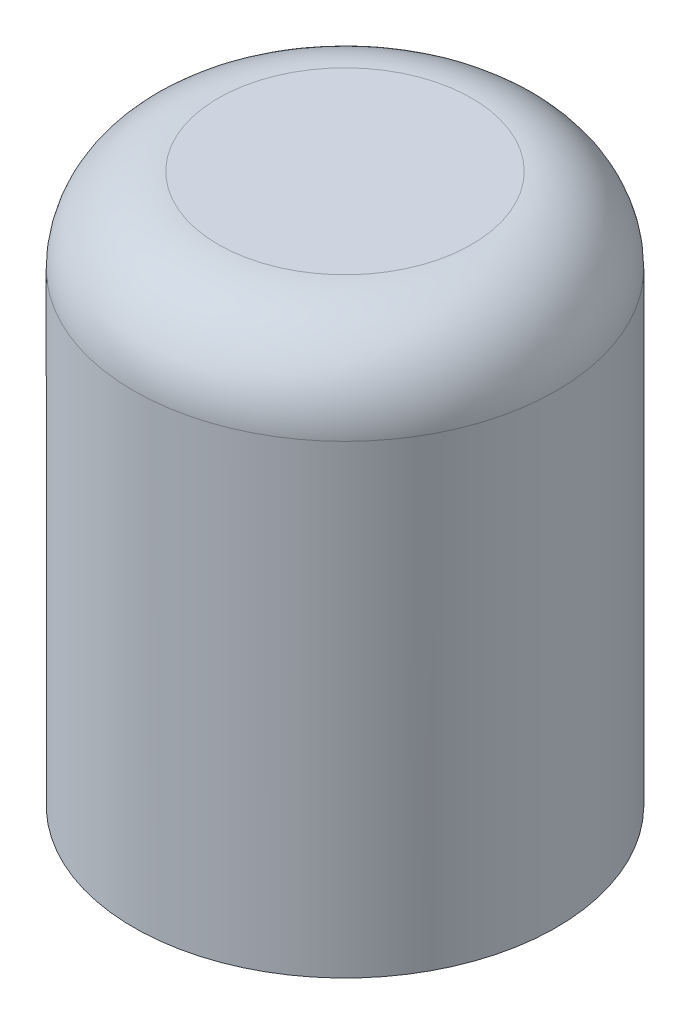
ISO-10303-21;
HEADER;
FILE_DESCRIPTION(('STEP AP214'),'2;1');
FILE_NAME('part.step','',(''),(''),'','','');
FILE_SCHEMA(('AUTOMOTIVE_DESIGN { 1 0 10303 214 1 1 1 1 }'));
ENDSEC;
DATA;
#1=APPLICATION_CONTEXT('core data for automotive mechanical design processes');
#2=APPLICATION_PROTOCOL_DEFINITION('international standard','automotive_design',2000,#1);
#3=PRODUCT_CONTEXT('',#1,'mechanical');
#4=PRODUCT('Part','Part','',(#3));
#5=PRODUCT_RELATED_PRODUCT_CATEGORY('part','',(#4));
#6=PRODUCT_DEFINITION_FORMATION('','',#4);
#7=PRODUCT_DEFINITION_CONTEXT('part definition',#1,'design');
#8=PRODUCT_DEFINITION('design','',#6,#7);
#9=PRODUCT_DEFINITION_SHAPE('','',#8);
#10=(LENGTH_UNIT() NAMED_UNIT(*) SI_UNIT(.MILLI.,.METRE.));
#11=(NAMED_UNIT(*) PLANE_ANGLE_UNIT() SI_UNIT($,.RADIAN.));
#12=(NAMED_UNIT(*) SI_UNIT($,.STERADIAN.) SOLID_ANGLE_UNIT());
#13=UNCERTAINTY_MEASURE_WITH_UNIT(LENGTH_MEASURE(1.E-05),#10,'distance_accuracy_value','');
#14=(GEOMETRIC_REPRESENTATION_CONTEXT(3) GLOBAL_UNCERTAINTY_ASSIGNED_CONTEXT((#13)) GLOBAL_UNIT_ASSIGNED_CONTEXT((#10,
#11,#12)) REPRESENTATION_CONTEXT('',''));
#15=CARTESIAN_POINT('',(0.,0.,0.));
#16=DIRECTION('',(0.,0.,1.));
#17=DIRECTION('',(1.,0.,0.));
#18=AXIS2_PLACEMENT_3D('',#15,#16,#17);
#19=CARTESIAN_POINT('',(0.,11.,0.));
#20=DIRECTION('',(0.,1.,0.));
#21=DIRECTION('',(0.,0.,1.));
#22=AXIS2_PLACEMENT_3D('',#19,#20,#21);
#23=TOROIDAL_SURFACE('',#22,3.,2.);
#24=CARTESIAN_POINT('',(0.,13.,0.));
#25=DIRECTION('',(0.,1.,0.));
#26=DIRECTION('',(0.,0.,1.));
#27=AXIS2_PLACEMENT_3D('',#24,#25,#26);
#28=CIRCLE('',#27,3.);
#29=CARTESIAN_POINT('',(0.,13.,3.));
#30=VERTEX_POINT('',#29);
#31=EDGE_CURVE('E40',#30,#30,#28,.T.);
#32=ORIENTED_EDGE('',*,*,#31,.F.);
#33=EDGE_LOOP('',(#32));
#34=FACE_BOUND('',#33,.T.);
#35=CARTESIAN_POINT('',(0.,11.,0.));
#36=DIRECTION('',(0.,1.,0.));
#37=DIRECTION('',(0.,0.,1.));
#38=AXIS2_PLACEMENT_3D('',#35,#36,#37);
#39=CIRCLE('',#38,5.);
#40=CARTESIAN_POINT('',(0.,11.,-5.));
#41=VERTEX_POINT('',#40);
#42=EDGE_CURVE('E11',#41,#41,#39,.F.);
#43=ORIENTED_EDGE('',*,*,#42,.F.);
#44=EDGE_LOOP('',(#43));
#45=FACE_BOUND('',#44,.T.);
#46=ADVANCED_FACE('F33',(#34,#45),#23,.T.);
#47=CARTESIAN_POINT('',(0.,0.5,0.));
#48=DIRECTION('',(0.,1.,0.));
#49=DIRECTION('',(0.,0.,1.));
#50=AXIS2_PLACEMENT_3D('',#47,#48,#49);
#51=TOROIDAL_SURFACE('',#50,4.,0.5);
#52=CARTESIAN_POINT('',(-2.,0.5,-2.87228132326901));
#53=CARTESIAN_POINT('',(-1.99996796118693,0.474102969831997,-2.87226245811748));
#54=CARTESIAN_POINT('',(-2.00200965743205,0.448232874445154,-2.87333084387989));
#55=CARTESIAN_POINT('',(-2.00998202741642,0.397366189846651,-2.87749084600549));
#56=CARTESIAN_POINT('',(-2.01589746755341,0.372366581334373,-2.88057453703134));
#57=CARTESIAN_POINT('',(-2.03135680678783,0.323864462817187,-2.8886130702187));
#58=CARTESIAN_POINT('',(-2.0408980647641,0.300360877592508,-2.89356655036938));
#59=CARTESIAN_POINT('',(-2.06320987923532,0.255367331478634,-2.90510982174575));
#60=CARTESIAN_POINT('',(-2.07598275846385,0.233878834229103,-2.91170078985715));
#61=CARTESIAN_POINT('',(-2.10497265211714,0.192390099897785,-2.92659798263136));
#62=CARTESIAN_POINT('',(-2.12132345362724,0.172507479458757,-2.93497032742728));
#63=CARTESIAN_POINT('',(-2.15653854441856,0.135743500678877,-2.95291316228432));
#64=CARTESIAN_POINT('',(-2.17540359723737,0.118863057700677,-2.96248401625982));
#65=CARTESIAN_POINT('',(-2.2172745303403,0.0866765270196369,-2.98361301247474));
#66=CARTESIAN_POINT('',(-2.24050752234995,0.0717337037196673,-2.99527419889862));
#67=CARTESIAN_POINT('',(-2.28880229612369,0.0459677336449976,-3.01936285672791));
#68=CARTESIAN_POINT('',(-2.31386533789604,0.0351474577737378,-3.03179085516122));
#69=CARTESIAN_POINT('',(-2.36473366962506,0.0179092348773098,-3.05685382919014));
#70=CARTESIAN_POINT('',(-2.39051715059658,0.0114147539696186,-3.06948092187401));
#71=CARTESIAN_POINT('',(-2.44267690007939,0.00259549837863331,-3.09486529695548));
#72=CARTESIAN_POINT('',(-2.46905178165597,0.000261828549880334,-3.10762224284373));
#73=CARTESIAN_POINT('',(-2.49695849806554,6.92378273316366E-06,-3.12103765471471));
#74=CARTESIAN_POINT('',(-2.49847926043113,-1.57015203602204E-08,-3.12176846195162));
#75=CARTESIAN_POINT('',(-2.5,0.,-3.1224989991992));
#76=B_SPLINE_CURVE_WITH_KNOTS('',3,(#52,#53,#54,#55,#56,#57,#58,#59,#60,#61,#62,#63,#64,#65,#66,
#67,#68,#69,#70,#71,#72,#73,#74,#75),.UNSPECIFIED.,.F.,.F.,(4,2,2,2,2,2,2,2,2,2,2,4),(0.,
0.0775465560316088,0.154789974800105,0.231977235372995,0.30922013282082,0.390097855640201,
0.471000195924946,0.560583149440672,0.65022837415425,0.73824215405155,0.826067547989993,
0.831129260973645),.UNSPECIFIED.);
#77=CARTESIAN_POINT('',(-2.5,0.,-3.1224989991992));
#78=VERTEX_POINT('',#77);
#79=CARTESIAN_POINT('',(-2.,0.5,-2.87228132326902));
#80=VERTEX_POINT('',#79);
#81=EDGE_CURVE('E55',#78,#80,#76,.F.);
#82=ORIENTED_EDGE('',*,*,#81,.F.);
#83=CARTESIAN_POINT('',(0.,0.,0.));
#84=DIRECTION('',(0.,1.,0.));
#85=DIRECTION('',(0.,0.,1.));
#86=AXIS2_PLACEMENT_3D('',#83,#84,#85);
#87=CIRCLE('',#86,4.);
#88=CARTESIAN_POINT('',(-2.5,0.,3.1224989991992));
#89=VERTEX_POINT('',#88);
#90=EDGE_CURVE('E85',#89,#78,#87,.T.);
#91=ORIENTED_EDGE('',*,*,#90,.F.);
#92=CARTESIAN_POINT('',(-2.,0.5,2.87228132326901));
#93=CARTESIAN_POINT('',(-1.99996796118693,0.474102969831997,2.87226245811748));
#94=CARTESIAN_POINT('',(-2.00200965743205,0.448232874445154,2.87333084387989));
#95=CARTESIAN_POINT('',(-2.00998202741642,0.397366189846651,2.87749084600549));
#96=CARTESIAN_POINT('',(-2.01589746755341,0.372366581334373,2.88057453703134));
#97=CARTESIAN_POINT('',(-2.03135680678783,0.323864462817187,2.8886130702187));
#98=CARTESIAN_POINT('',(-2.0408980647641,0.300360877592508,2.89356655036938));
#99=CARTESIAN_POINT('',(-2.06320987923532,0.255367331478634,2.90510982174575));
#100=CARTESIAN_POINT('',(-2.07598275846385,0.233878834229103,2.91170078985715));
#101=CARTESIAN_POINT('',(-2.10497265211714,0.192390099897785,2.92659798263136));
#102=CARTESIAN_POINT('',(-2.12132345362724,0.172507479458757,2.93497032742728));
#103=CARTESIAN_POINT('',(-2.15653854441856,0.135743500678877,2.95291316228432));
#104=CARTESIAN_POINT('',(-2.17540359723737,0.118863057700677,2.96248401625982));
#105=CARTESIAN_POINT('',(-2.2172745303403,0.0866765270196369,2.98361301247474));
#106=CARTESIAN_POINT('',(-2.24050752234995,0.0717337037196673,2.99527419889862));
#107=CARTESIAN_POINT('',(-2.28880229612369,0.0459677336449976,3.01936285672791));
#108=CARTESIAN_POINT('',(-2.31386533789604,0.0351474577737378,3.03179085516122));
#109=CARTESIAN_POINT('',(-2.36473366962506,0.0179092348773098,3.05685382919014));
#110=CARTESIAN_POINT('',(-2.39051715059658,0.0114147539696186,3.06948092187401));
#111=CARTESIAN_POINT('',(-2.44267690007939,0.00259549837863331,3.09486529695548));
#112=CARTESIAN_POINT('',(-2.46905178165597,0.000261828549880334,3.10762224284373));
#113=CARTESIAN_POINT('',(-2.49695849806554,6.92378273316366E-06,3.12103765471471));
#114=CARTESIAN_POINT('',(-2.49847926043113,-1.57015203602204E-08,3.12176846195162));
#115=CARTESIAN_POINT('',(-2.5,0.,3.1224989991992));
#116=B_SPLINE_CURVE_WITH_KNOTS('',3,(#92,#93,#94,#95,#96,#97,#98,#99,#100,#101,#102,#103,#104,
#105,#106,#107,#108,#109,#110,#111,#112,#113,#114,#115),.UNSPECIFIED.,.F.,.F.,(4,2,2,2,2,2,2,2,
2,2,2,4),(0.,0.0775465560316088,0.154789974800105,0.231977235372995,0.30922013282082,
0.390097855640201,0.471000195924946,0.560583149440672,0.65022837415425,0.73824215405155,
0.826067547989993,0.831129260973645),.UNSPECIFIED.);
#117=CARTESIAN_POINT('',(-2.,0.5,2.87228132326902));
#118=VERTEX_POINT('',#117);
#119=EDGE_CURVE('E47',#89,#118,#116,.F.);
#120=ORIENTED_EDGE('',*,*,#119,.T.);
#121=CARTESIAN_POINT('',(0.,0.5,0.));
#122=DIRECTION('',(0.,1.,0.));
#123=DIRECTION('',(0.,0.,1.));
#124=AXIS2_PLACEMENT_3D('',#121,#122,#123);
#125=CIRCLE('',#124,3.5);
#126=EDGE_CURVE('E105',#80,#118,#125,.F.);
#127=ORIENTED_EDGE('',*,*,#126,.F.);
#128=EDGE_LOOP('',(#82,#91,#120,#127));
#129=FACE_BOUND('',#128,.T.);
#130=ADVANCED_FACE('F128',(#129),#51,.T.);
#131=CARTESIAN_POINT('',(-2.5,0.5,0.));
#132=DIRECTION('',(0.,0.,1.));
#133=DIRECTION('',(1.,0.,0.));
#134=AXIS2_PLACEMENT_3D('',#131,#132,#133);
#135=CYLINDRICAL_SURFACE('',#134,0.5);
#136=DIRECTION('',(0.,0.,1.));
#137=VECTOR('',#136,1.);
#138=CARTESIAN_POINT('',(-2.5,0.,0.));
#139=LINE('',#138,#137);
#140=EDGE_CURVE('E241',#78,#89,#139,.T.);
#141=ORIENTED_EDGE('',*,*,#140,.F.);
#142=ORIENTED_EDGE('',*,*,#81,.T.);
#143=DIRECTION('',(0.,0.,1.));
#144=VECTOR('',#143,1.);
#145=CARTESIAN_POINT('',(-2.,0.5,2.87228132326902));
#146=LINE('',#145,#144);
#147=EDGE_CURVE('E242',#118,#80,#146,.F.);
#148=ORIENTED_EDGE('',*,*,#147,.F.);
#149=ORIENTED_EDGE('',*,*,#119,.F.);
#150=EDGE_LOOP('',(#141,#142,#148,#149));
#151=FACE_BOUND('',#150,.T.);
#152=ADVANCED_FACE('F127',(#151),#135,.T.);
#153=CARTESIAN_POINT('',(0.,10.5,2.87228132326902));
#154=DIRECTION('',(0.,0.,1.));
#155=DIRECTION('',(1.,0.,0.));
#156=AXIS2_PLACEMENT_3D('',#153,#154,#155);
#157=CYLINDRICAL_SURFACE('',#156,2.);
#158=CARTESIAN_POINT('',(-2.,10.5,2.87228132326902));
#159=CARTESIAN_POINT('',(-2.00000802891589,10.5512280873468,2.87228320357465));
#160=CARTESIAN_POINT('',(-1.99803193425012,10.6024523135562,2.87125347405935));
#161=CARTESIAN_POINT('',(-1.99017269657205,10.7045066843849,2.86714593599443));
#162=CARTESIAN_POINT('',(-1.98429040156483,10.7553369121156,2.86406857196972));
#163=CARTESIAN_POINT('',(-1.96870366370365,10.8560859681388,2.85589335069733));
#164=CARTESIAN_POINT('',(-1.95901090581844,10.9060070990934,2.85080167014984));
#165=CARTESIAN_POINT('',(-1.93592986312032,11.0047268942419,2.83863104450278));
#166=CARTESIAN_POINT('',(-1.9225415074567,11.0535255368966,2.8315520613033));
#167=CARTESIAN_POINT('',(-1.8770576050361,11.1976945693897,2.80738969782715));
#168=CARTESIAN_POINT('',(-1.8396233879687,11.2909637029675,2.78737069534271));
#169=CARTESIAN_POINT('',(-1.7522216430458,11.4693343664015,2.73993155655443));
#170=CARTESIAN_POINT('',(-1.70224893002741,11.554432497045,2.71250835796544));
#171=CARTESIAN_POINT('',(-1.58997488579266,11.7174109128988,2.64970610053265));
#172=CARTESIAN_POINT('',(-1.52731667479379,11.7949539665925,2.61409132811055));
#173=CARTESIAN_POINT('',(-1.39332203868639,11.9381522354492,2.53603801797219));
#174=CARTESIAN_POINT('',(-1.32198332917205,12.0038043099584,2.49359768305539));
#175=CARTESIAN_POINT('',(-1.16606340665065,12.1282405827742,2.39805839980073));
#176=CARTESIAN_POINT('',(-1.08086820219515,12.1857681093505,2.34432835440877));
#177=CARTESIAN_POINT('',(-0.906369830076943,12.285670356669,2.22988504232878));
#178=CARTESIAN_POINT('',(-0.817063644256816,12.3280337374626,2.1691665942743));
#179=CARTESIAN_POINT('',(-0.625521456422716,12.4027986807924,2.03268815598898));
#180=CARTESIAN_POINT('',(-0.52314269513484,12.4331315164266,1.95600140267259));
#181=CARTESIAN_POINT('',(-0.321356309637283,12.4767049848016,1.79459775430449));
#182=CARTESIAN_POINT('',(-0.221945450252646,12.4899649459295,1.70989005674124));
#183=CARTESIAN_POINT('',(-0.0854436196532082,12.4985895217914,1.58358348842916));
#184=CARTESIAN_POINT('',(-0.0455088125374097,12.4998660135879,1.54533122290352));
#185=CARTESIAN_POINT('',(-0.00421859627508591,12.4999966636286,1.5042141498394));
#186=CARTESIAN_POINT('',(-0.00210818636963591,12.4999999970217,1.50210818401739));
#187=CARTESIAN_POINT('',(0.,12.5,1.5));
#188=B_SPLINE_CURVE_WITH_KNOTS('',3,(#158,#159,#160,#161,#162,#163,#164,#165,#166,#167,#168,
#169,#170,#171,#172,#173,#174,#175,#176,#177,#178,#179,#180,#181,#182,#183,#184,#185,#186,#187),
.UNSPECIFIED.,.F.,.F.,(4,2,2,2,2,2,2,2,2,2,2,2,2,2,4),(0.,0.153629235194084,0.30722512959992,
0.460353643496103,0.613485093322493,0.919370048226547,1.22538170772135,1.54164315461396,
1.85798801127799,2.20457681789414,2.55142426938113,2.94431153675618,3.33675361995058,
3.50262203901414,3.51156632148605),.UNSPECIFIED.);
#189=CARTESIAN_POINT('',(-2.,10.5,2.87228132326902));
#190=VERTEX_POINT('',#189);
#191=CARTESIAN_POINT('',(0.,12.5,1.5));
#192=VERTEX_POINT('',#191);
#193=EDGE_CURVE('E74',#190,#192,#188,.T.);
#194=ORIENTED_EDGE('',*,*,#193,.F.);
#195=DIRECTION('',(0.,0.,1.));
#196=VECTOR('',#195,1.);
#197=CARTESIAN_POINT('',(-2.,10.5,2.87228132326902));
#198=LINE('',#197,#196);
#199=CARTESIAN_POINT('',(-2.,10.5,-2.87228132326902));
#200=VERTEX_POINT('',#199);
#201=EDGE_CURVE('E77',#200,#190,#198,.T.);
#202=ORIENTED_EDGE('',*,*,#201,.F.);
#203=CARTESIAN_POINT('',(-2.,10.5,-2.87228132326902));
#204=CARTESIAN_POINT('',(-2.00000802891589,10.5512280873468,-2.87228320357465));
#205=CARTESIAN_POINT('',(-1.99803193425012,10.6024523135562,-2.87125347405935));
#206=CARTESIAN_POINT('',(-1.99017269657205,10.7045066843849,-2.86714593599443));
#207=CARTESIAN_POINT('',(-1.98429040156483,10.7553369121156,-2.86406857196972));
#208=CARTESIAN_POINT('',(-1.96870366370365,10.8560859681388,-2.85589335069733));
#209=CARTESIAN_POINT('',(-1.95901090581844,10.9060070990934,-2.85080167014984));
#210=CARTESIAN_POINT('',(-1.93592986312032,11.0047268942419,-2.83863104450278));
#211=CARTESIAN_POINT('',(-1.9225415074567,11.0535255368966,-2.8315520613033));
#212=CARTESIAN_POINT('',(-1.8770576050361,11.1976945693897,-2.80738969782715));
#213=CARTESIAN_POINT('',(-1.8396233879687,11.2909637029675,-2.78737069534271));
#214=CARTESIAN_POINT('',(-1.7522216430458,11.4693343664015,-2.73993155655443));
#215=CARTESIAN_POINT('',(-1.70224893002741,11.554432497045,-2.71250835796544));
#216=CARTESIAN_POINT('',(-1.58997488579266,11.7174109128988,-2.64970610053265));
#217=CARTESIAN_POINT('',(-1.52731667479379,11.7949539665925,-2.61409132811055));
#218=CARTESIAN_POINT('',(-1.39332203868639,11.9381522354492,-2.53603801797219));
#219=CARTESIAN_POINT('',(-1.32198332917205,12.0038043099584,-2.49359768305539));
#220=CARTESIAN_POINT('',(-1.16606340665065,12.1282405827742,-2.39805839980073));
#221=CARTESIAN_POINT('',(-1.08086820219515,12.1857681093505,-2.34432835440877));
#222=CARTESIAN_POINT('',(-0.906369830076943,12.285670356669,-2.22988504232878));
#223=CARTESIAN_POINT('',(-0.817063644256816,12.3280337374626,-2.1691665942743));
#224=CARTESIAN_POINT('',(-0.625521456422716,12.4027986807924,-2.03268815598898));
#225=CARTESIAN_POINT('',(-0.52314269513484,12.4331315164266,-1.95600140267259));
#226=CARTESIAN_POINT('',(-0.321356309637283,12.4767049848016,-1.79459775430449));
#227=CARTESIAN_POINT('',(-0.221945450252646,12.4899649459295,-1.70989005674124));
#228=CARTESIAN_POINT('',(-0.0854436196532082,12.4985895217914,-1.58358348842916));
#229=CARTESIAN_POINT('',(-0.0455088125374097,12.4998660135879,-1.54533122290352));
#230=CARTESIAN_POINT('',(-0.00421859627508591,12.4999966636286,-1.5042141498394));
#231=CARTESIAN_POINT('',(-0.00210818636963591,12.4999999970217,-1.50210818401739));
#232=CARTESIAN_POINT('',(0.,12.5,-1.5));
#233=B_SPLINE_CURVE_WITH_KNOTS('',3,(#203,#204,#205,#206,#207,#208,#209,#210,#211,#212,#213,
#214,#215,#216,#217,#218,#219,#220,#221,#222,#223,#224,#225,#226,#227,#228,#229,#230,#231,#232),
.UNSPECIFIED.,.F.,.F.,(4,2,2,2,2,2,2,2,2,2,2,2,2,2,4),(0.,0.153629235194084,0.30722512959992,
0.460353643496103,0.613485093322493,0.919370048226547,1.22538170772135,1.54164315461396,
1.85798801127799,2.20457681789414,2.55142426938113,2.94431153675618,3.33675361995058,
3.50262203901414,3.51156632148605),.UNSPECIFIED.);
#234=CARTESIAN_POINT('',(0.,12.5,-1.5));
#235=VERTEX_POINT('',#234);
#236=EDGE_CURVE('E86',#200,#235,#233,.T.);
#237=ORIENTED_EDGE('',*,*,#236,.T.);
#238=DIRECTION('',(0.,0.,1.));
#239=VECTOR('',#238,1.);
#240=CARTESIAN_POINT('',(0.,12.5,0.));
#241=LINE('',#240,#239);
#242=EDGE_CURVE('E80',#192,#235,#241,.F.);
#243=ORIENTED_EDGE('',*,*,#242,.F.);
#244=EDGE_LOOP('',(#194,#202,#237,#243));
#245=FACE_BOUND('',#244,.T.);
#246=ADVANCED_FACE('F76',(#245),#157,.F.);
#247=CARTESIAN_POINT('',(0.,10.5,0.));
#248=DIRECTION('',(0.,-1.,0.));
#249=DIRECTION('',(0.,0.,-1.));
#250=AXIS2_PLACEMENT_3D('',#247,#248,#249);
#251=DEGENERATE_TOROIDAL_SURFACE('',#250,1.5,2.,.T.);
#252=CARTESIAN_POINT('',(0.,10.5,0.));
#253=DIRECTION('',(0.,-1.,0.));
#254=DIRECTION('',(0.,0.,-1.));
#255=AXIS2_PLACEMENT_3D('',#252,#253,#254);
#256=CIRCLE('',#255,3.5);
#257=EDGE_CURVE('E99',#190,#200,#256,.F.);
#258=ORIENTED_EDGE('',*,*,#257,.F.);
#259=ORIENTED_EDGE('',*,*,#193,.T.);
#260=CARTESIAN_POINT('',(0.,12.5,0.));
#261=DIRECTION('',(0.,-1.,0.));
#262=DIRECTION('',(0.,0.,-1.));
#263=AXIS2_PLACEMENT_3D('',#260,#261,#262);
#264=CIRCLE('',#263,1.5);
#265=EDGE_CURVE('E97',#235,#192,#264,.T.);
#266=ORIENTED_EDGE('',*,*,#265,.F.);
#267=ORIENTED_EDGE('',*,*,#236,.F.);
#268=EDGE_LOOP('',(#258,#259,#266,#267));
#269=FACE_BOUND('',#268,.T.);
#270=ADVANCED_FACE('F100',(#269),#251,.F.);
#271=CARTESIAN_POINT('',(0.,13.,0.));
#272=DIRECTION('',(0.,-1.,0.));
#273=DIRECTION('',(0.,0.,-1.));
#274=AXIS2_PLACEMENT_3D('',#271,#272,#273);
#275=CYLINDRICAL_SURFACE('',#274,5.);
#276=CARTESIAN_POINT('',(0.,0.,0.));
#277=DIRECTION('',(0.,1.,0.));
#278=DIRECTION('',(0.,0.,1.));
#279=AXIS2_PLACEMENT_3D('',#276,#277,#278);
#280=CIRCLE('',#279,5.);
#281=CARTESIAN_POINT('',(0.,0.,-5.));
#282=VERTEX_POINT('',#281);
#283=EDGE_CURVE('E102',#282,#282,#280,.T.);
#284=CARTESIAN_POINT('',(0.,11.,-5.));
#285=CARTESIAN_POINT('',(0.,10.8854166666667,-5.));
#286=CARTESIAN_POINT('',(0.,10.7708333333333,-5.));
#287=CARTESIAN_POINT('',(0.,10.5416666666667,-5.));
#288=CARTESIAN_POINT('',(0.,10.4270833333333,-5.));
#289=CARTESIAN_POINT('',(0.,10.1979166666667,-5.));
#290=CARTESIAN_POINT('',(0.,10.0833333333333,-5.));
#291=CARTESIAN_POINT('',(0.,9.85416666666667,-5.));
#292=CARTESIAN_POINT('',(0.,9.73958333333333,-5.));
#293=CARTESIAN_POINT('',(0.,9.51041666666667,-5.));
#294=CARTESIAN_POINT('',(0.,9.39583333333333,-5.));
#295=CARTESIAN_POINT('',(0.,9.16666666666666,-5.));
#296=CARTESIAN_POINT('',(0.,9.05208333333333,-5.));
#297=CARTESIAN_POINT('',(0.,8.82291666666666,-5.));
#298=CARTESIAN_POINT('',(0.,8.70833333333333,-5.));
#299=CARTESIAN_POINT('',(0.,8.47916666666666,-5.));
#300=CARTESIAN_POINT('',(0.,8.36458333333333,-5.));
#301=CARTESIAN_POINT('',(0.,8.13541666666667,-5.));
#302=CARTESIAN_POINT('',(0.,8.02083333333333,-5.));
#303=CARTESIAN_POINT('',(0.,7.79166666666667,-5.));
#304=CARTESIAN_POINT('',(0.,7.67708333333333,-5.));
#305=CARTESIAN_POINT('',(0.,7.44791666666667,-5.));
#306=CARTESIAN_POINT('',(0.,7.33333333333333,-5.));
#307=CARTESIAN_POINT('',(0.,7.10416666666667,-5.));
#308=CARTESIAN_POINT('',(0.,6.98958333333333,-5.));
#309=CARTESIAN_POINT('',(0.,6.76041666666667,-5.));
#310=CARTESIAN_POINT('',(0.,6.64583333333333,-5.));
#311=CARTESIAN_POINT('',(0.,6.41666666666667,-5.));
#312=CARTESIAN_POINT('',(0.,6.30208333333333,-5.));
#313=CARTESIAN_POINT('',(0.,6.07291666666667,-5.));
#314=CARTESIAN_POINT('',(0.,5.95833333333333,-5.));
#315=CARTESIAN_POINT('',(0.,5.72916666666667,-5.));
#316=CARTESIAN_POINT('',(0.,5.61458333333333,-5.));
#317=CARTESIAN_POINT('',(0.,5.38541666666667,-5.));
#318=CARTESIAN_POINT('',(0.,5.27083333333333,-5.));
#319=CARTESIAN_POINT('',(0.,5.04166666666667,-5.));
#320=CARTESIAN_POINT('',(0.,4.92708333333333,-5.));
#321=CARTESIAN_POINT('',(0.,4.69791666666667,-5.));
#322=CARTESIAN_POINT('',(0.,4.58333333333333,-5.));
#323=CARTESIAN_POINT('',(0.,4.35416666666667,-5.));
#324=CARTESIAN_POINT('',(0.,4.23958333333333,-5.));
#325=CARTESIAN_POINT('',(0.,4.01041666666667,-5.));
#326=CARTESIAN_POINT('',(0.,3.89583333333333,-5.));
#327=CARTESIAN_POINT('',(0.,3.66666666666667,-5.));
#328=CARTESIAN_POINT('',(0.,3.55208333333333,-5.));
#329=CARTESIAN_POINT('',(0.,3.32291666666667,-5.));
#330=CARTESIAN_POINT('',(0.,3.20833333333333,-5.));
#331=CARTESIAN_POINT('',(0.,2.97916666666667,-5.));
#332=CARTESIAN_POINT('',(0.,2.86458333333333,-5.));
#333=CARTESIAN_POINT('',(0.,2.63541666666667,-5.));
#334=CARTESIAN_POINT('',(0.,2.52083333333333,-5.));
#335=CARTESIAN_POINT('',(0.,2.29166666666667,-5.));
#336=CARTESIAN_POINT('',(0.,2.17708333333333,-5.));
#337=CARTESIAN_POINT('',(0.,1.94791666666667,-5.));
#338=CARTESIAN_POINT('',(0.,1.83333333333333,-5.));
#339=CARTESIAN_POINT('',(0.,1.60416666666667,-5.));
#340=CARTESIAN_POINT('',(0.,1.48958333333333,-5.));
#341=CARTESIAN_POINT('',(0.,1.26041666666667,-5.));
#342=CARTESIAN_POINT('',(0.,1.14583333333333,-5.));
#343=CARTESIAN_POINT('',(0.,0.916666666666666,-5.));
#344=CARTESIAN_POINT('',(0.,0.802083333333333,-5.));
#345=CARTESIAN_POINT('',(0.,0.572916666666667,-5.));
#346=CARTESIAN_POINT('',(0.,0.458333333333334,-5.));
#347=CARTESIAN_POINT('',(0.,0.229166666666667,-5.));
#348=CARTESIAN_POINT('',(0.,0.114583333333334,-5.));
#349=CARTESIAN_POINT('',(0.,0.,-5.));
#350=B_SPLINE_CURVE_WITH_KNOTS('',3,(#284,#285,#286,#287,#288,#289,#290,#291,#292,#293,#294,
#295,#296,#297,#298,#299,#300,#301,#302,#303,#304,#305,#306,#307,#308,#309,#310,#311,#312,#313,
#314,#315,#316,#317,#318,#319,#320,#321,#322,#323,#324,#325,#326,#327,#328,#329,#330,#331,#332,
#333,#334,#335,#336,#337,#338,#339,#340,#341,#342,#343,#344,#345,#346,#347,#348,#349),
.UNSPECIFIED.,.F.,.F.,(4,2,2,2,2,2,2,2,2,2,2,2,2,2,2,2,2,2,2,2,2,2,2,2,2,2,2,2,2,2,2,2,4),(0.,
0.343749999999999,0.687499999999999,1.03125,1.375,1.71875,2.0625,2.40625,2.75,3.09375,3.4375,
3.78125,4.125,4.46875,4.8125,5.15625,5.5,5.84375,6.1875,6.53125,6.875,7.21875,7.5625,7.90625,
8.25,8.59375,8.9375,9.28125,9.625,9.96875,10.3125,10.65625,11.),.UNSPECIFIED.);
#351=EDGE_CURVE('BSEAM152',#41,#282,#350,.T.);
#352=ORIENTED_EDGE('',*,*,#42,.T.);
#353=ORIENTED_EDGE('',*,*,#283,.T.);
#354=ORIENTED_EDGE('',*,*,#351,.T.);
#355=ORIENTED_EDGE('',*,*,#351,.F.);
#356=EDGE_LOOP('',(#352,#354,#353,#355));
#357=FACE_BOUND('',#356,.T.);
#358=ADVANCED_FACE('F152',(#357),#275,.T.);
#359=CARTESIAN_POINT('',(0.,13.,0.));
#360=DIRECTION('',(0.,1.,0.));
#361=DIRECTION('',(0.,0.,1.));
#362=AXIS2_PLACEMENT_3D('',#359,#360,#361);
#363=PLANE('',#362);
#364=ORIENTED_EDGE('',*,*,#31,.T.);
#365=EDGE_LOOP('',(#364));
#366=FACE_BOUND('',#365,.T.);
#367=ADVANCED_FACE('F146',(#366),#363,.T.);
#368=CARTESIAN_POINT('',(0.,0.,0.));
#369=DIRECTION('',(0.,1.,0.));
#370=DIRECTION('',(0.,0.,1.));
#371=AXIS2_PLACEMENT_3D('',#368,#369,#370);
#372=PLANE('',#371);
#373=ORIENTED_EDGE('',*,*,#90,.T.);
#374=ORIENTED_EDGE('',*,*,#140,.T.);
#375=EDGE_LOOP('',(#373,#374));
#376=FACE_BOUND('',#375,.T.);
#377=ORIENTED_EDGE('',*,*,#283,.F.);
#378=EDGE_LOOP('',(#377));
#379=FACE_BOUND('',#378,.T.);
#380=ADVANCED_FACE('F157',(#376,#379),#372,.F.);
#381=CARTESIAN_POINT('',(0.,12.5,0.));
#382=DIRECTION('',(0.,-1.,0.));
#383=DIRECTION('',(0.,0.,-1.));
#384=AXIS2_PLACEMENT_3D('',#381,#382,#383);
#385=CYLINDRICAL_SURFACE('',#384,3.5);
#386=DIRECTION('',(0.,-1.,0.));
#387=VECTOR('',#386,1.);
#388=CARTESIAN_POINT('',(-2.,12.5,-2.87228132326902));
#389=LINE('',#388,#387);
#390=EDGE_CURVE('E96',#200,#80,#389,.T.);
#391=ORIENTED_EDGE('',*,*,#390,.T.);
#392=ORIENTED_EDGE('',*,*,#126,.T.);
#393=DIRECTION('',(0.,-1.,0.));
#394=VECTOR('',#393,1.);
#395=CARTESIAN_POINT('',(-2.,12.5,2.87228132326902));
#396=LINE('',#395,#394);
#397=EDGE_CURVE('E94',#190,#118,#396,.T.);
#398=ORIENTED_EDGE('',*,*,#397,.F.);
#399=ORIENTED_EDGE('',*,*,#257,.T.);
#400=EDGE_LOOP('',(#391,#392,#398,#399));
#401=FACE_BOUND('',#400,.T.);
#402=ADVANCED_FACE('F104',(#401),#385,.F.);
#403=CARTESIAN_POINT('',(-2.,12.5,2.87228132326902));
#404=DIRECTION('',(-1.,0.,0.));
#405=DIRECTION('',(0.,0.,1.));
#406=AXIS2_PLACEMENT_3D('',#403,#404,#405);
#407=PLANE('',#406);
#408=ORIENTED_EDGE('',*,*,#397,.T.);
#409=ORIENTED_EDGE('',*,*,#147,.T.);
#410=ORIENTED_EDGE('',*,*,#390,.F.);
#411=ORIENTED_EDGE('',*,*,#201,.T.);
#412=EDGE_LOOP('',(#408,#409,#410,#411));
#413=FACE_BOUND('',#412,.T.);
#414=ADVANCED_FACE('F91',(#413),#407,.F.);
#415=CARTESIAN_POINT('',(0.,12.5,0.));
#416=DIRECTION('',(0.,-1.,0.));
#417=DIRECTION('',(0.,0.,-1.));
#418=AXIS2_PLACEMENT_3D('',#415,#416,#417);
#419=PLANE('',#418);
#420=ORIENTED_EDGE('',*,*,#242,.T.);
#421=ORIENTED_EDGE('',*,*,#265,.T.);
#422=EDGE_LOOP('',(#420,#421));
#423=FACE_BOUND('',#422,.T.);
#424=ADVANCED_FACE('F171',(#423),#419,.T.);
#425=CLOSED_SHELL('',(#46,#130,#152,#246,#270,#358,#367,#380,#402,#414,#424));
#426=MANIFOLD_SOLID_BREP('B2',#425);
#427=ADVANCED_BREP_SHAPE_REPRESENTATION('',(#18,#426),#14);
#428=SHAPE_DEFINITION_REPRESENTATION(#9,#427);
ENDSEC;
END-ISO-10303-21;
